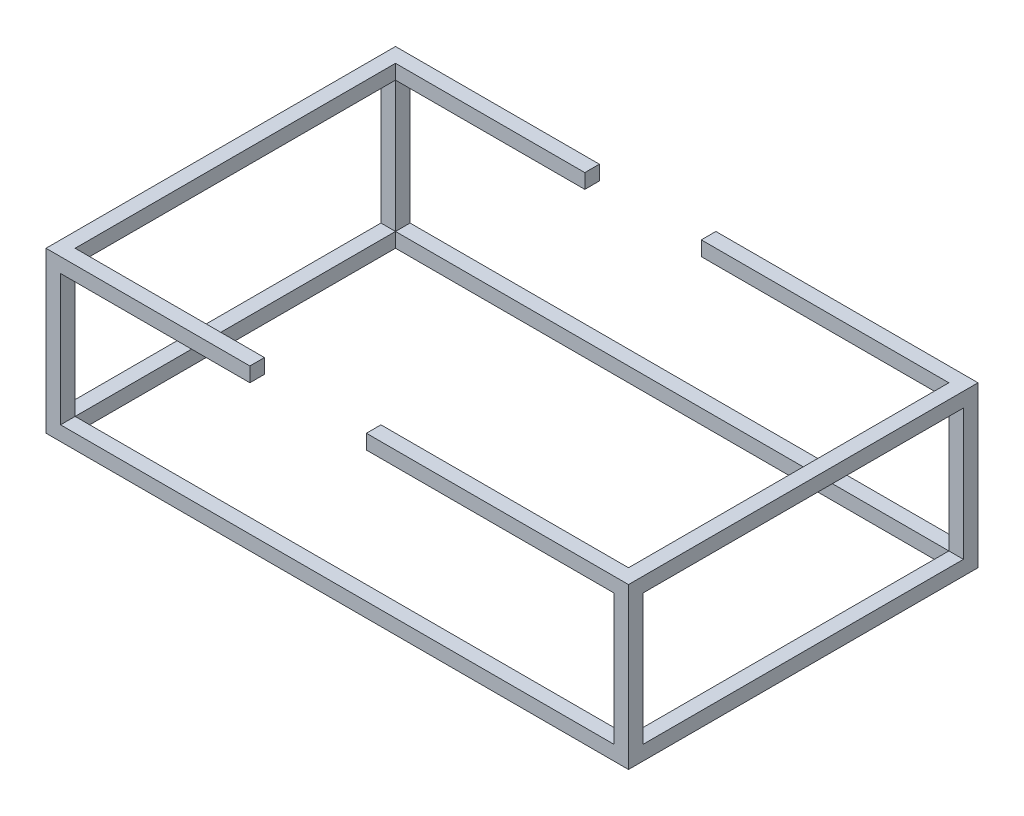
ISO-10303-21;
HEADER;
FILE_DESCRIPTION(('STEP AP214'),'2;1');
FILE_NAME('part.step','',(''),(''),'','','');
FILE_SCHEMA(('AUTOMOTIVE_DESIGN { 1 0 10303 214 1 1 1 1 }'));
ENDSEC;
DATA;
#1=APPLICATION_CONTEXT('core data for automotive mechanical design processes');
#2=APPLICATION_PROTOCOL_DEFINITION('international standard','automotive_design',2000,#1);
#3=PRODUCT_CONTEXT('',#1,'mechanical');
#4=PRODUCT('Part','Part','',(#3));
#5=PRODUCT_RELATED_PRODUCT_CATEGORY('part','',(#4));
#6=PRODUCT_DEFINITION_FORMATION('','',#4);
#7=PRODUCT_DEFINITION_CONTEXT('part definition',#1,'design');
#8=PRODUCT_DEFINITION('design','',#6,#7);
#9=PRODUCT_DEFINITION_SHAPE('','',#8);
#10=(LENGTH_UNIT() NAMED_UNIT(*) SI_UNIT(.MILLI.,.METRE.));
#11=(NAMED_UNIT(*) PLANE_ANGLE_UNIT() SI_UNIT($,.RADIAN.));
#12=(NAMED_UNIT(*) SI_UNIT($,.STERADIAN.) SOLID_ANGLE_UNIT());
#13=UNCERTAINTY_MEASURE_WITH_UNIT(LENGTH_MEASURE(1.E-05),#10,'distance_accuracy_value','');
#14=(GEOMETRIC_REPRESENTATION_CONTEXT(3) GLOBAL_UNCERTAINTY_ASSIGNED_CONTEXT((#13)) GLOBAL_UNIT_ASSIGNED_CONTEXT((#10,
#11,#12)) REPRESENTATION_CONTEXT('',''));
#15=CARTESIAN_POINT('',(0.,0.,0.));
#16=DIRECTION('',(0.,0.,1.));
#17=DIRECTION('',(1.,0.,0.));
#18=AXIS2_PLACEMENT_3D('',#15,#16,#17);
#19=CARTESIAN_POINT('',(-508.,254.,-279.4));
#20=DIRECTION('',(0.,0.,-1.));
#21=DIRECTION('',(-1.,0.,0.));
#22=AXIS2_PLACEMENT_3D('',#19,#20,#21);
#23=PLANE('',#22);
#24=DIRECTION('',(0.,1.,0.));
#25=VECTOR('',#24,1.);
#26=CARTESIAN_POINT('',(-482.6,254.,-279.4));
#27=LINE('',#26,#25);
#28=CARTESIAN_POINT('',(-482.6,254.,-279.4));
#29=VERTEX_POINT('',#28);
#30=CARTESIAN_POINT('',(-482.6,279.4,-279.4));
#31=VERTEX_POINT('',#30);
#32=EDGE_CURVE('E59',#29,#31,#27,.T.);
#33=ORIENTED_EDGE('',*,*,#32,.F.);
#34=DIRECTION('',(1.,0.,0.));
#35=VECTOR('',#34,1.);
#36=CARTESIAN_POINT('',(-508.,254.,-279.4));
#37=LINE('',#36,#35);
#38=CARTESIAN_POINT('',(-152.4,254.,-279.4));
#39=VERTEX_POINT('',#38);
#40=EDGE_CURVE('E330',#29,#39,#37,.T.);
#41=ORIENTED_EDGE('',*,*,#40,.T.);
#42=DIRECTION('',(0.,-1.,0.));
#43=VECTOR('',#42,1.);
#44=CARTESIAN_POINT('',(-152.4,254.,-279.4));
#45=LINE('',#44,#43);
#46=CARTESIAN_POINT('',(-152.4,279.4,-279.4));
#47=VERTEX_POINT('',#46);
#48=EDGE_CURVE('E320',#47,#39,#45,.T.);
#49=ORIENTED_EDGE('',*,*,#48,.F.);
#50=DIRECTION('',(1.,0.,0.));
#51=VECTOR('',#50,1.);
#52=CARTESIAN_POINT('',(-508.,279.4,-279.4));
#53=LINE('',#52,#51);
#54=EDGE_CURVE('E332',#31,#47,#53,.T.);
#55=ORIENTED_EDGE('',*,*,#54,.F.);
#56=EDGE_LOOP('',(#33,#41,#49,#55));
#57=FACE_BOUND('',#56,.T.);
#58=ADVANCED_FACE('F36',(#57),#23,.F.);
#59=DIRECTION('',(1.,0.,0.));
#60=VECTOR('',#59,1.);
#61=CARTESIAN_POINT('',(-482.6,254.,-279.4));
#62=LINE('',#61,#60);
#63=CARTESIAN_POINT('',(-508.,254.,-279.4));
#64=VERTEX_POINT('',#63);
#65=EDGE_CURVE('E242',#64,#29,#62,.T.);
#66=ORIENTED_EDGE('',*,*,#65,.F.);
#67=DIRECTION('',(0.,-1.,0.));
#68=VECTOR('',#67,1.);
#69=CARTESIAN_POINT('',(-508.,254.,-279.4));
#70=LINE('',#69,#68);
#71=CARTESIAN_POINT('',(-508.,25.4,-279.4));
#72=VERTEX_POINT('',#71);
#73=EDGE_CURVE('E413',#64,#72,#70,.T.);
#74=ORIENTED_EDGE('',*,*,#73,.T.);
#75=DIRECTION('',(1.,0.,0.));
#76=VECTOR('',#75,1.);
#77=CARTESIAN_POINT('',(-508.,25.4,-279.4));
#78=LINE('',#77,#76);
#79=CARTESIAN_POINT('',(-482.6,25.4,-279.4));
#80=VERTEX_POINT('',#79);
#81=EDGE_CURVE('E398',#72,#80,#78,.T.);
#82=ORIENTED_EDGE('',*,*,#81,.T.);
#83=DIRECTION('',(0.,-1.,0.));
#84=VECTOR('',#83,1.);
#85=CARTESIAN_POINT('',(-482.6,254.,-279.4));
#86=LINE('',#85,#84);
#87=EDGE_CURVE('E410',#29,#80,#86,.T.);
#88=ORIENTED_EDGE('',*,*,#87,.F.);
#89=EDGE_LOOP('',(#66,#74,#82,#88));
#90=FACE_BOUND('',#89,.T.);
#91=ADVANCED_FACE('F598',(#90),#23,.F.);
#92=CARTESIAN_POINT('',(-482.6,254.,279.4));
#93=DIRECTION('',(0.,0.,1.));
#94=DIRECTION('',(1.,0.,0.));
#95=AXIS2_PLACEMENT_3D('',#92,#93,#94);
#96=PLANE('',#95);
#97=DIRECTION('',(0.,1.,0.));
#98=VECTOR('',#97,1.);
#99=CARTESIAN_POINT('',(-482.6,254.,279.4));
#100=LINE('',#99,#98);
#101=CARTESIAN_POINT('',(-482.6,254.,279.4));
#102=VERTEX_POINT('',#101);
#103=CARTESIAN_POINT('',(-482.6,279.4,279.4));
#104=VERTEX_POINT('',#103);
#105=EDGE_CURVE('E237',#102,#104,#100,.T.);
#106=ORIENTED_EDGE('',*,*,#105,.T.);
#107=DIRECTION('',(1.,0.,0.));
#108=VECTOR('',#107,1.);
#109=CARTESIAN_POINT('',(-508.,279.4,279.4));
#110=LINE('',#109,#108);
#111=CARTESIAN_POINT('',(-152.4,279.4,279.4));
#112=VERTEX_POINT('',#111);
#113=EDGE_CURVE('E222',#104,#112,#110,.T.);
#114=ORIENTED_EDGE('',*,*,#113,.T.);
#115=DIRECTION('',(0.,1.,0.));
#116=VECTOR('',#115,1.);
#117=CARTESIAN_POINT('',(-152.4,254.,279.4));
#118=LINE('',#117,#116);
#119=CARTESIAN_POINT('',(-152.4,254.,279.4));
#120=VERTEX_POINT('',#119);
#121=EDGE_CURVE('E329',#120,#112,#118,.T.);
#122=ORIENTED_EDGE('',*,*,#121,.F.);
#123=DIRECTION('',(1.,0.,0.));
#124=VECTOR('',#123,1.);
#125=CARTESIAN_POINT('',(-508.,254.,279.4));
#126=LINE('',#125,#124);
#127=EDGE_CURVE('E239',#102,#120,#126,.T.);
#128=ORIENTED_EDGE('',*,*,#127,.F.);
#129=EDGE_LOOP('',(#106,#114,#122,#128));
#130=FACE_BOUND('',#129,.T.);
#131=ADVANCED_FACE('F238',(#130),#96,.F.);
#132=DIRECTION('',(1.,0.,0.));
#133=VECTOR('',#132,1.);
#134=CARTESIAN_POINT('',(-482.6,254.,279.4));
#135=LINE('',#134,#133);
#136=CARTESIAN_POINT('',(-508.,254.,279.4));
#137=VERTEX_POINT('',#136);
#138=EDGE_CURVE('E241',#137,#102,#135,.T.);
#139=ORIENTED_EDGE('',*,*,#138,.T.);
#140=DIRECTION('',(0.,-1.,0.));
#141=VECTOR('',#140,1.);
#142=CARTESIAN_POINT('',(-482.6,254.,279.4));
#143=LINE('',#142,#141);
#144=CARTESIAN_POINT('',(-482.6,25.4,279.4));
#145=VERTEX_POINT('',#144);
#146=EDGE_CURVE('E361',#102,#145,#143,.T.);
#147=ORIENTED_EDGE('',*,*,#146,.T.);
#148=DIRECTION('',(-1.,0.,0.));
#149=VECTOR('',#148,1.);
#150=CARTESIAN_POINT('',(-482.6,25.4,279.4));
#151=LINE('',#150,#149);
#152=CARTESIAN_POINT('',(-508.,25.4,279.4));
#153=VERTEX_POINT('',#152);
#154=EDGE_CURVE('E354',#145,#153,#151,.T.);
#155=ORIENTED_EDGE('',*,*,#154,.T.);
#156=DIRECTION('',(0.,-1.,0.));
#157=VECTOR('',#156,1.);
#158=CARTESIAN_POINT('',(-508.,254.,279.4));
#159=LINE('',#158,#157);
#160=EDGE_CURVE('E51',#137,#153,#159,.T.);
#161=ORIENTED_EDGE('',*,*,#160,.F.);
#162=EDGE_LOOP('',(#139,#147,#155,#161));
#163=FACE_BOUND('',#162,.T.);
#164=ADVANCED_FACE('F575',(#163),#96,.F.);
#165=CARTESIAN_POINT('',(508.,254.,-279.4));
#166=DIRECTION('',(0.,0.,-1.));
#167=DIRECTION('',(-1.,0.,0.));
#168=AXIS2_PLACEMENT_3D('',#165,#166,#167);
#169=PLANE('',#168);
#170=DIRECTION('',(0.,-1.,0.));
#171=VECTOR('',#170,1.);
#172=CARTESIAN_POINT('',(482.6,279.4,-279.4));
#173=LINE('',#172,#171);
#174=CARTESIAN_POINT('',(482.6,279.4,-279.4));
#175=VERTEX_POINT('',#174);
#176=CARTESIAN_POINT('',(482.6,254.,-279.4));
#177=VERTEX_POINT('',#176);
#178=EDGE_CURVE('E245',#175,#177,#173,.T.);
#179=ORIENTED_EDGE('',*,*,#178,.F.);
#180=DIRECTION('',(-1.,0.,0.));
#181=VECTOR('',#180,1.);
#182=CARTESIAN_POINT('',(508.,279.4,-279.4));
#183=LINE('',#182,#181);
#184=CARTESIAN_POINT('',(50.8000000000001,279.4,-279.4));
#185=VERTEX_POINT('',#184);
#186=EDGE_CURVE('E288',#175,#185,#183,.T.);
#187=ORIENTED_EDGE('',*,*,#186,.T.);
#188=DIRECTION('',(0.,1.,0.));
#189=VECTOR('',#188,1.);
#190=CARTESIAN_POINT('',(50.8000000000001,254.,-279.4));
#191=LINE('',#190,#189);
#192=CARTESIAN_POINT('',(50.8000000000001,254.,-279.4));
#193=VERTEX_POINT('',#192);
#194=EDGE_CURVE('E278',#193,#185,#191,.T.);
#195=ORIENTED_EDGE('',*,*,#194,.F.);
#196=DIRECTION('',(-1.,0.,0.));
#197=VECTOR('',#196,1.);
#198=CARTESIAN_POINT('',(508.,254.,-279.4));
#199=LINE('',#198,#197);
#200=EDGE_CURVE('E290',#177,#193,#199,.T.);
#201=ORIENTED_EDGE('',*,*,#200,.F.);
#202=EDGE_LOOP('',(#179,#187,#195,#201));
#203=FACE_BOUND('',#202,.T.);
#204=ADVANCED_FACE('F548',(#203),#169,.F.);
#205=DIRECTION('',(1.,0.,0.));
#206=VECTOR('',#205,1.);
#207=CARTESIAN_POINT('',(508.,254.,-279.4));
#208=LINE('',#207,#206);
#209=CARTESIAN_POINT('',(508.,254.,-279.4));
#210=VERTEX_POINT('',#209);
#211=EDGE_CURVE('E249',#177,#210,#208,.T.);
#212=ORIENTED_EDGE('',*,*,#211,.F.);
#213=DIRECTION('',(0.,-1.,0.));
#214=VECTOR('',#213,1.);
#215=CARTESIAN_POINT('',(482.6,254.,-279.4));
#216=LINE('',#215,#214);
#217=CARTESIAN_POINT('',(482.6,25.4,-279.4));
#218=VERTEX_POINT('',#217);
#219=EDGE_CURVE('E392',#177,#218,#216,.T.);
#220=ORIENTED_EDGE('',*,*,#219,.T.);
#221=DIRECTION('',(1.,0.,0.));
#222=VECTOR('',#221,1.);
#223=CARTESIAN_POINT('',(508.,25.4,-279.4));
#224=LINE('',#223,#222);
#225=CARTESIAN_POINT('',(508.,25.4,-279.4));
#226=VERTEX_POINT('',#225);
#227=EDGE_CURVE('E386',#218,#226,#224,.T.);
#228=ORIENTED_EDGE('',*,*,#227,.T.);
#229=DIRECTION('',(0.,-1.,0.));
#230=VECTOR('',#229,1.);
#231=CARTESIAN_POINT('',(508.,254.,-279.4));
#232=LINE('',#231,#230);
#233=EDGE_CURVE('E385',#210,#226,#232,.T.);
#234=ORIENTED_EDGE('',*,*,#233,.F.);
#235=EDGE_LOOP('',(#212,#220,#228,#234));
#236=FACE_BOUND('',#235,.T.);
#237=ADVANCED_FACE('F534',(#236),#169,.F.);
#238=CARTESIAN_POINT('',(482.6,254.,279.4));
#239=DIRECTION('',(0.,0.,1.));
#240=DIRECTION('',(1.,0.,0.));
#241=AXIS2_PLACEMENT_3D('',#238,#239,#240);
#242=PLANE('',#241);
#243=DIRECTION('',(0.,-1.,0.));
#244=VECTOR('',#243,1.);
#245=CARTESIAN_POINT('',(482.6,279.4,279.4));
#246=LINE('',#245,#244);
#247=CARTESIAN_POINT('',(482.6,279.4,279.4));
#248=VERTEX_POINT('',#247);
#249=CARTESIAN_POINT('',(482.6,254.,279.4));
#250=VERTEX_POINT('',#249);
#251=EDGE_CURVE('E255',#248,#250,#246,.T.);
#252=ORIENTED_EDGE('',*,*,#251,.T.);
#253=DIRECTION('',(-1.,0.,0.));
#254=VECTOR('',#253,1.);
#255=CARTESIAN_POINT('',(508.,254.,279.4));
#256=LINE('',#255,#254);
#257=CARTESIAN_POINT('',(50.8000000000001,254.,279.4));
#258=VERTEX_POINT('',#257);
#259=EDGE_CURVE('E306',#250,#258,#256,.T.);
#260=ORIENTED_EDGE('',*,*,#259,.T.);
#261=DIRECTION('',(0.,-1.,0.));
#262=VECTOR('',#261,1.);
#263=CARTESIAN_POINT('',(50.8000000000001,254.,279.4));
#264=LINE('',#263,#262);
#265=CARTESIAN_POINT('',(50.8000000000001,279.4,279.4));
#266=VERTEX_POINT('',#265);
#267=EDGE_CURVE('E287',#266,#258,#264,.T.);
#268=ORIENTED_EDGE('',*,*,#267,.F.);
#269=DIRECTION('',(-1.,0.,0.));
#270=VECTOR('',#269,1.);
#271=CARTESIAN_POINT('',(508.,279.4,279.4));
#272=LINE('',#271,#270);
#273=EDGE_CURVE('E307',#248,#266,#272,.T.);
#274=ORIENTED_EDGE('',*,*,#273,.F.);
#275=EDGE_LOOP('',(#252,#260,#268,#274));
#276=FACE_BOUND('',#275,.T.);
#277=ADVANCED_FACE('F556',(#276),#242,.F.);
#278=DIRECTION('',(1.,0.,0.));
#279=VECTOR('',#278,1.);
#280=CARTESIAN_POINT('',(508.,254.,279.4));
#281=LINE('',#280,#279);
#282=CARTESIAN_POINT('',(508.,254.,279.4));
#283=VERTEX_POINT('',#282);
#284=EDGE_CURVE('E258',#250,#283,#281,.T.);
#285=ORIENTED_EDGE('',*,*,#284,.T.);
#286=DIRECTION('',(0.,-1.,0.));
#287=VECTOR('',#286,1.);
#288=CARTESIAN_POINT('',(508.,254.,279.4));
#289=LINE('',#288,#287);
#290=CARTESIAN_POINT('',(508.,25.4,279.4));
#291=VERTEX_POINT('',#290);
#292=EDGE_CURVE('E376',#283,#291,#289,.T.);
#293=ORIENTED_EDGE('',*,*,#292,.T.);
#294=DIRECTION('',(-1.,0.,0.));
#295=VECTOR('',#294,1.);
#296=CARTESIAN_POINT('',(482.6,25.4,279.4));
#297=LINE('',#296,#295);
#298=CARTESIAN_POINT('',(482.6,25.4,279.4));
#299=VERTEX_POINT('',#298);
#300=EDGE_CURVE('E369',#291,#299,#297,.T.);
#301=ORIENTED_EDGE('',*,*,#300,.T.);
#302=DIRECTION('',(0.,-1.,0.));
#303=VECTOR('',#302,1.);
#304=CARTESIAN_POINT('',(482.6,254.,279.4));
#305=LINE('',#304,#303);
#306=EDGE_CURVE('E368',#250,#299,#305,.T.);
#307=ORIENTED_EDGE('',*,*,#306,.F.);
#308=EDGE_LOOP('',(#285,#293,#301,#307));
#309=FACE_BOUND('',#308,.T.);
#310=ADVANCED_FACE('F529',(#309),#242,.F.);
#311=CARTESIAN_POINT('',(0.,25.4,0.));
#312=DIRECTION('',(0.,-1.,0.));
#313=DIRECTION('',(0.,0.,-1.));
#314=AXIS2_PLACEMENT_3D('',#311,#312,#313);
#315=PLANE('',#314);
#316=DIRECTION('',(0.,0.,-1.));
#317=VECTOR('',#316,1.);
#318=CARTESIAN_POINT('',(-482.6,25.4,279.4));
#319=LINE('',#318,#317);
#320=CARTESIAN_POINT('',(-482.6,25.4,304.8));
#321=VERTEX_POINT('',#320);
#322=EDGE_CURVE('E346',#321,#145,#319,.T.);
#323=ORIENTED_EDGE('',*,*,#322,.F.);
#324=DIRECTION('',(1.,0.,0.));
#325=VECTOR('',#324,1.);
#326=CARTESIAN_POINT('',(-508.,25.4,304.8));
#327=LINE('',#326,#325);
#328=CARTESIAN_POINT('',(482.6,25.4,304.8));
#329=VERTEX_POINT('',#328);
#330=EDGE_CURVE('E459',#321,#329,#327,.T.);
#331=ORIENTED_EDGE('',*,*,#330,.T.);
#332=DIRECTION('',(0.,0.,1.));
#333=VECTOR('',#332,1.);
#334=CARTESIAN_POINT('',(482.6,25.4,279.4));
#335=LINE('',#334,#333);
#336=EDGE_CURVE('E364',#299,#329,#335,.T.);
#337=ORIENTED_EDGE('',*,*,#336,.F.);
#338=DIRECTION('',(1.,0.,0.));
#339=VECTOR('',#338,1.);
#340=CARTESIAN_POINT('',(-482.6,25.4,279.4));
#341=LINE('',#340,#339);
#342=EDGE_CURVE('E419',#145,#299,#341,.T.);
#343=ORIENTED_EDGE('',*,*,#342,.F.);
#344=EDGE_LOOP('',(#323,#331,#337,#343));
#345=FACE_BOUND('',#344,.T.);
#346=ADVANCED_FACE('F513',(#345),#315,.F.);
#347=ORIENTED_EDGE('',*,*,#154,.F.);
#348=DIRECTION('',(0.,0.,1.));
#349=VECTOR('',#348,1.);
#350=CARTESIAN_POINT('',(-482.6,25.4,279.4));
#351=LINE('',#350,#349);
#352=EDGE_CURVE('E416',#80,#145,#351,.T.);
#353=ORIENTED_EDGE('',*,*,#352,.F.);
#354=ORIENTED_EDGE('',*,*,#81,.F.);
#355=DIRECTION('',(0.,0.,1.));
#356=VECTOR('',#355,1.);
#357=CARTESIAN_POINT('',(-508.,25.4,304.8));
#358=LINE('',#357,#356);
#359=EDGE_CURVE('E456',#72,#153,#358,.T.);
#360=ORIENTED_EDGE('',*,*,#359,.T.);
#361=EDGE_LOOP('',(#347,#353,#354,#360));
#362=FACE_BOUND('',#361,.T.);
#363=ADVANCED_FACE('F573',(#362),#315,.F.);
#364=ORIENTED_EDGE('',*,*,#300,.F.);
#365=DIRECTION('',(0.,0.,-1.));
#366=VECTOR('',#365,1.);
#367=CARTESIAN_POINT('',(508.,25.4,304.8));
#368=LINE('',#367,#366);
#369=EDGE_CURVE('E450',#291,#226,#368,.T.);
#370=ORIENTED_EDGE('',*,*,#369,.T.);
#371=ORIENTED_EDGE('',*,*,#227,.F.);
#372=DIRECTION('',(0.,0.,-1.));
#373=VECTOR('',#372,1.);
#374=CARTESIAN_POINT('',(482.6,25.4,279.4));
#375=LINE('',#374,#373);
#376=EDGE_CURVE('E423',#299,#218,#375,.T.);
#377=ORIENTED_EDGE('',*,*,#376,.F.);
#378=EDGE_LOOP('',(#364,#370,#371,#377));
#379=FACE_BOUND('',#378,.T.);
#380=ADVANCED_FACE('F525',(#379),#315,.F.);
#381=DIRECTION('',(0.,0.,1.));
#382=VECTOR('',#381,1.);
#383=CARTESIAN_POINT('',(482.6,25.4,-304.8));
#384=LINE('',#383,#382);
#385=CARTESIAN_POINT('',(482.6,25.4,-304.8));
#386=VERTEX_POINT('',#385);
#387=EDGE_CURVE('E381',#386,#218,#384,.T.);
#388=ORIENTED_EDGE('',*,*,#387,.F.);
#389=DIRECTION('',(-1.,0.,0.));
#390=VECTOR('',#389,1.);
#391=CARTESIAN_POINT('',(-508.,25.4,-304.8));
#392=LINE('',#391,#390);
#393=CARTESIAN_POINT('',(-482.6,25.4,-304.8));
#394=VERTEX_POINT('',#393);
#395=EDGE_CURVE('E453',#386,#394,#392,.T.);
#396=ORIENTED_EDGE('',*,*,#395,.T.);
#397=DIRECTION('',(0.,0.,-1.));
#398=VECTOR('',#397,1.);
#399=CARTESIAN_POINT('',(-482.6,25.4,-304.8));
#400=LINE('',#399,#398);
#401=EDGE_CURVE('E403',#80,#394,#400,.T.);
#402=ORIENTED_EDGE('',*,*,#401,.F.);
#403=DIRECTION('',(-1.,0.,0.));
#404=VECTOR('',#403,1.);
#405=CARTESIAN_POINT('',(-482.6,25.4,-279.4));
#406=LINE('',#405,#404);
#407=EDGE_CURVE('E426',#218,#80,#406,.T.);
#408=ORIENTED_EDGE('',*,*,#407,.F.);
#409=EDGE_LOOP('',(#388,#396,#402,#408));
#410=FACE_BOUND('',#409,.T.);
#411=ADVANCED_FACE('F564',(#410),#315,.F.);
#412=CARTESIAN_POINT('',(0.,0.,0.));
#413=DIRECTION('',(0.,-1.,0.));
#414=DIRECTION('',(0.,0.,-1.));
#415=AXIS2_PLACEMENT_3D('',#412,#413,#414);
#416=PLANE('',#415);
#417=DIRECTION('',(0.,0.,-1.));
#418=VECTOR('',#417,1.);
#419=CARTESIAN_POINT('',(508.,0.,304.8));
#420=LINE('',#419,#418);
#421=CARTESIAN_POINT('',(508.,0.,304.8));
#422=VERTEX_POINT('',#421);
#423=CARTESIAN_POINT('',(508.,0.,-304.8));
#424=VERTEX_POINT('',#423);
#425=EDGE_CURVE('E449',#422,#424,#420,.T.);
#426=ORIENTED_EDGE('',*,*,#425,.F.);
#427=DIRECTION('',(1.,0.,0.));
#428=VECTOR('',#427,1.);
#429=CARTESIAN_POINT('',(-508.,0.,304.8));
#430=LINE('',#429,#428);
#431=CARTESIAN_POINT('',(-508.,0.,304.8));
#432=VERTEX_POINT('',#431);
#433=EDGE_CURVE('E454',#432,#422,#430,.T.);
#434=ORIENTED_EDGE('',*,*,#433,.F.);
#435=DIRECTION('',(0.,0.,1.));
#436=VECTOR('',#435,1.);
#437=CARTESIAN_POINT('',(-508.,0.,304.8));
#438=LINE('',#437,#436);
#439=CARTESIAN_POINT('',(-508.,0.,-304.8));
#440=VERTEX_POINT('',#439);
#441=EDGE_CURVE('E466',#440,#432,#438,.T.);
#442=ORIENTED_EDGE('',*,*,#441,.F.);
#443=DIRECTION('',(-1.,0.,0.));
#444=VECTOR('',#443,1.);
#445=CARTESIAN_POINT('',(-508.,0.,-304.8));
#446=LINE('',#445,#444);
#447=EDGE_CURVE('E464',#424,#440,#446,.T.);
#448=ORIENTED_EDGE('',*,*,#447,.F.);
#449=EDGE_LOOP('',(#426,#434,#442,#448));
#450=FACE_BOUND('',#449,.T.);
#451=DIRECTION('',(-1.,0.,0.));
#452=VECTOR('',#451,1.);
#453=CARTESIAN_POINT('',(-482.6,0.,-279.4));
#454=LINE('',#453,#452);
#455=CARTESIAN_POINT('',(482.6,0.,-279.4));
#456=VERTEX_POINT('',#455);
#457=CARTESIAN_POINT('',(-482.6,0.,-279.4));
#458=VERTEX_POINT('',#457);
#459=EDGE_CURVE('E420',#456,#458,#454,.T.);
#460=ORIENTED_EDGE('',*,*,#459,.T.);
#461=DIRECTION('',(0.,0.,1.));
#462=VECTOR('',#461,1.);
#463=CARTESIAN_POINT('',(-482.6,0.,279.4));
#464=LINE('',#463,#462);
#465=CARTESIAN_POINT('',(-482.6,0.,279.4));
#466=VERTEX_POINT('',#465);
#467=EDGE_CURVE('E415',#458,#466,#464,.T.);
#468=ORIENTED_EDGE('',*,*,#467,.T.);
#469=DIRECTION('',(1.,0.,0.));
#470=VECTOR('',#469,1.);
#471=CARTESIAN_POINT('',(-482.6,0.,279.4));
#472=LINE('',#471,#470);
#473=CARTESIAN_POINT('',(482.6,0.,279.4));
#474=VERTEX_POINT('',#473);
#475=EDGE_CURVE('E432',#466,#474,#472,.T.);
#476=ORIENTED_EDGE('',*,*,#475,.T.);
#477=DIRECTION('',(0.,0.,-1.));
#478=VECTOR('',#477,1.);
#479=CARTESIAN_POINT('',(482.6,0.,279.4));
#480=LINE('',#479,#478);
#481=EDGE_CURVE('E435',#474,#456,#480,.T.);
#482=ORIENTED_EDGE('',*,*,#481,.T.);
#483=EDGE_LOOP('',(#460,#468,#476,#482));
#484=FACE_BOUND('',#483,.T.);
#485=ADVANCED_FACE('F483',(#450,#484),#416,.T.);
#486=CARTESIAN_POINT('',(508.,25.4,304.8));
#487=DIRECTION('',(-1.,0.,0.));
#488=DIRECTION('',(0.,0.,1.));
#489=AXIS2_PLACEMENT_3D('',#486,#487,#488);
#490=PLANE('',#489);
#491=DIRECTION('',(0.,0.,-1.));
#492=VECTOR('',#491,1.);
#493=CARTESIAN_POINT('',(508.,254.,279.4));
#494=LINE('',#493,#492);
#495=EDGE_CURVE('E260',#283,#210,#494,.T.);
#496=ORIENTED_EDGE('',*,*,#495,.T.);
#497=ORIENTED_EDGE('',*,*,#233,.T.);
#498=ORIENTED_EDGE('',*,*,#369,.F.);
#499=ORIENTED_EDGE('',*,*,#292,.F.);
#500=EDGE_LOOP('',(#496,#497,#498,#499));
#501=FACE_BOUND('',#500,.T.);
#502=ORIENTED_EDGE('',*,*,#425,.T.);
#503=DIRECTION('',(0.,-1.,0.));
#504=VECTOR('',#503,1.);
#505=CARTESIAN_POINT('',(508.,25.4,-304.8));
#506=LINE('',#505,#504);
#507=CARTESIAN_POINT('',(508.,279.4,-304.8));
#508=VERTEX_POINT('',#507);
#509=EDGE_CURVE('E11',#508,#424,#506,.T.);
#510=ORIENTED_EDGE('',*,*,#509,.F.);
#511=DIRECTION('',(0.,0.,-1.));
#512=VECTOR('',#511,1.);
#513=CARTESIAN_POINT('',(508.,279.4,279.4));
#514=LINE('',#513,#512);
#515=CARTESIAN_POINT('',(508.,279.4,304.8));
#516=VERTEX_POINT('',#515);
#517=EDGE_CURVE('E304',#516,#508,#514,.T.);
#518=ORIENTED_EDGE('',*,*,#517,.F.);
#519=DIRECTION('',(0.,-1.,0.));
#520=VECTOR('',#519,1.);
#521=CARTESIAN_POINT('',(508.,25.4,304.8));
#522=LINE('',#521,#520);
#523=EDGE_CURVE('E461',#516,#422,#522,.T.);
#524=ORIENTED_EDGE('',*,*,#523,.T.);
#525=EDGE_LOOP('',(#502,#510,#518,#524));
#526=FACE_BOUND('',#525,.T.);
#527=ADVANCED_FACE('F38',(#501,#526),#490,.F.);
#528=CARTESIAN_POINT('',(-508.,25.4,-304.8));
#529=DIRECTION('',(0.,0.,1.));
#530=DIRECTION('',(1.,0.,0.));
#531=AXIS2_PLACEMENT_3D('',#528,#529,#530);
#532=PLANE('',#531);
#533=ORIENTED_EDGE('',*,*,#447,.T.);
#534=DIRECTION('',(0.,-1.,0.));
#535=VECTOR('',#534,1.);
#536=CARTESIAN_POINT('',(-508.,25.4,-304.8));
#537=LINE('',#536,#535);
#538=CARTESIAN_POINT('',(-508.,279.4,-304.8));
#539=VERTEX_POINT('',#538);
#540=EDGE_CURVE('E44',#539,#440,#537,.T.);
#541=ORIENTED_EDGE('',*,*,#540,.F.);
#542=DIRECTION('',(1.,0.,0.));
#543=VECTOR('',#542,1.);
#544=CARTESIAN_POINT('',(-508.,279.4,-304.8));
#545=LINE('',#544,#543);
#546=CARTESIAN_POINT('',(-152.4,279.4,-304.8));
#547=VERTEX_POINT('',#546);
#548=EDGE_CURVE('E326',#539,#547,#545,.T.);
#549=ORIENTED_EDGE('',*,*,#548,.T.);
#550=DIRECTION('',(0.,1.,0.));
#551=VECTOR('',#550,1.);
#552=CARTESIAN_POINT('',(-152.4,254.,-304.8));
#553=LINE('',#552,#551);
#554=CARTESIAN_POINT('',(-152.4,254.,-304.8));
#555=VERTEX_POINT('',#554);
#556=EDGE_CURVE('E309',#555,#547,#553,.T.);
#557=ORIENTED_EDGE('',*,*,#556,.F.);
#558=DIRECTION('',(1.,0.,0.));
#559=VECTOR('',#558,1.);
#560=CARTESIAN_POINT('',(-508.,254.,-304.8));
#561=LINE('',#560,#559);
#562=CARTESIAN_POINT('',(-482.6,254.,-304.8));
#563=VERTEX_POINT('',#562);
#564=EDGE_CURVE('E327',#563,#555,#561,.T.);
#565=ORIENTED_EDGE('',*,*,#564,.F.);
#566=DIRECTION('',(0.,-1.,0.));
#567=VECTOR('',#566,1.);
#568=CARTESIAN_POINT('',(-482.6,254.,-304.8));
#569=LINE('',#568,#567);
#570=EDGE_CURVE('E402',#563,#394,#569,.T.);
#571=ORIENTED_EDGE('',*,*,#570,.T.);
#572=ORIENTED_EDGE('',*,*,#395,.F.);
#573=DIRECTION('',(0.,-1.,0.));
#574=VECTOR('',#573,1.);
#575=CARTESIAN_POINT('',(482.6,254.,-304.8));
#576=LINE('',#575,#574);
#577=CARTESIAN_POINT('',(482.6,254.,-304.8));
#578=VERTEX_POINT('',#577);
#579=EDGE_CURVE('E395',#578,#386,#576,.T.);
#580=ORIENTED_EDGE('',*,*,#579,.F.);
#581=DIRECTION('',(-1.,0.,0.));
#582=VECTOR('',#581,1.);
#583=CARTESIAN_POINT('',(508.,254.,-304.8));
#584=LINE('',#583,#582);
#585=CARTESIAN_POINT('',(50.8000000000001,254.,-304.8));
#586=VERTEX_POINT('',#585);
#587=EDGE_CURVE('E284',#578,#586,#584,.T.);
#588=ORIENTED_EDGE('',*,*,#587,.T.);
#589=DIRECTION('',(0.,-1.,0.));
#590=VECTOR('',#589,1.);
#591=CARTESIAN_POINT('',(50.8000000000001,254.,-304.8));
#592=LINE('',#591,#590);
#593=CARTESIAN_POINT('',(50.8000000000001,279.4,-304.8));
#594=VERTEX_POINT('',#593);
#595=EDGE_CURVE('E272',#594,#586,#592,.T.);
#596=ORIENTED_EDGE('',*,*,#595,.F.);
#597=DIRECTION('',(-1.,0.,0.));
#598=VECTOR('',#597,1.);
#599=CARTESIAN_POINT('',(508.,279.4,-304.8));
#600=LINE('',#599,#598);
#601=EDGE_CURVE('E285',#508,#594,#600,.T.);
#602=ORIENTED_EDGE('',*,*,#601,.F.);
#603=ORIENTED_EDGE('',*,*,#509,.T.);
#604=EDGE_LOOP('',(#533,#541,#549,#557,#565,#571,#572,#580,#588,#596,#602,#603));
#605=FACE_BOUND('',#604,.T.);
#606=ADVANCED_FACE('F560',(#605),#532,.F.);
#607=CARTESIAN_POINT('',(-508.,25.4,304.8));
#608=DIRECTION('',(1.,0.,0.));
#609=DIRECTION('',(0.,0.,-1.));
#610=AXIS2_PLACEMENT_3D('',#607,#608,#609);
#611=PLANE('',#610);
#612=ORIENTED_EDGE('',*,*,#73,.F.);
#613=DIRECTION('',(0.,0.,-1.));
#614=VECTOR('',#613,1.);
#615=CARTESIAN_POINT('',(-508.,254.,279.4));
#616=LINE('',#615,#614);
#617=EDGE_CURVE('E246',#137,#64,#616,.T.);
#618=ORIENTED_EDGE('',*,*,#617,.F.);
#619=ORIENTED_EDGE('',*,*,#160,.T.);
#620=ORIENTED_EDGE('',*,*,#359,.F.);
#621=EDGE_LOOP('',(#612,#618,#619,#620));
#622=FACE_BOUND('',#621,.T.);
#623=ORIENTED_EDGE('',*,*,#441,.T.);
#624=DIRECTION('',(0.,-1.,0.));
#625=VECTOR('',#624,1.);
#626=CARTESIAN_POINT('',(-508.,25.4,304.8));
#627=LINE('',#626,#625);
#628=CARTESIAN_POINT('',(-508.,279.4,304.8));
#629=VERTEX_POINT('',#628);
#630=EDGE_CURVE('E471',#629,#432,#627,.T.);
#631=ORIENTED_EDGE('',*,*,#630,.F.);
#632=DIRECTION('',(0.,0.,1.));
#633=VECTOR('',#632,1.);
#634=CARTESIAN_POINT('',(-508.,279.4,279.4));
#635=LINE('',#634,#633);
#636=EDGE_CURVE('E233',#539,#629,#635,.T.);
#637=ORIENTED_EDGE('',*,*,#636,.F.);
#638=ORIENTED_EDGE('',*,*,#540,.T.);
#639=EDGE_LOOP('',(#623,#631,#637,#638));
#640=FACE_BOUND('',#639,.T.);
#641=ADVANCED_FACE('F477',(#622,#640),#611,.F.);
#642=CARTESIAN_POINT('',(-508.,25.4,304.8));
#643=DIRECTION('',(0.,0.,-1.));
#644=DIRECTION('',(-1.,0.,0.));
#645=AXIS2_PLACEMENT_3D('',#642,#643,#644);
#646=PLANE('',#645);
#647=ORIENTED_EDGE('',*,*,#433,.T.);
#648=ORIENTED_EDGE('',*,*,#523,.F.);
#649=DIRECTION('',(-1.,0.,0.));
#650=VECTOR('',#649,1.);
#651=CARTESIAN_POINT('',(508.,279.4,304.8));
#652=LINE('',#651,#650);
#653=CARTESIAN_POINT('',(50.8000000000001,279.4,304.8));
#654=VERTEX_POINT('',#653);
#655=EDGE_CURVE('E310',#516,#654,#652,.T.);
#656=ORIENTED_EDGE('',*,*,#655,.T.);
#657=DIRECTION('',(0.,1.,0.));
#658=VECTOR('',#657,1.);
#659=CARTESIAN_POINT('',(50.8000000000001,254.,304.8));
#660=LINE('',#659,#658);
#661=CARTESIAN_POINT('',(50.8000000000001,254.,304.8));
#662=VERTEX_POINT('',#661);
#663=EDGE_CURVE('E298',#662,#654,#660,.T.);
#664=ORIENTED_EDGE('',*,*,#663,.F.);
#665=DIRECTION('',(-1.,0.,0.));
#666=VECTOR('',#665,1.);
#667=CARTESIAN_POINT('',(508.,254.,304.8));
#668=LINE('',#667,#666);
#669=CARTESIAN_POINT('',(482.6,254.,304.8));
#670=VERTEX_POINT('',#669);
#671=EDGE_CURVE('E312',#670,#662,#668,.T.);
#672=ORIENTED_EDGE('',*,*,#671,.F.);
#673=DIRECTION('',(0.,-1.,0.));
#674=VECTOR('',#673,1.);
#675=CARTESIAN_POINT('',(482.6,254.,304.8));
#676=LINE('',#675,#674);
#677=EDGE_CURVE('E378',#670,#329,#676,.T.);
#678=ORIENTED_EDGE('',*,*,#677,.T.);
#679=ORIENTED_EDGE('',*,*,#330,.F.);
#680=DIRECTION('',(0.,-1.,0.));
#681=VECTOR('',#680,1.);
#682=CARTESIAN_POINT('',(-482.6,254.,304.8));
#683=LINE('',#682,#681);
#684=CARTESIAN_POINT('',(-482.6,254.,304.8));
#685=VERTEX_POINT('',#684);
#686=EDGE_CURVE('E353',#685,#321,#683,.T.);
#687=ORIENTED_EDGE('',*,*,#686,.F.);
#688=DIRECTION('',(1.,0.,0.));
#689=VECTOR('',#688,1.);
#690=CARTESIAN_POINT('',(-508.,254.,304.8));
#691=LINE('',#690,#689);
#692=CARTESIAN_POINT('',(-152.4,254.,304.8));
#693=VERTEX_POINT('',#692);
#694=EDGE_CURVE('E347',#685,#693,#691,.T.);
#695=ORIENTED_EDGE('',*,*,#694,.T.);
#696=DIRECTION('',(0.,-1.,0.));
#697=VECTOR('',#696,1.);
#698=CARTESIAN_POINT('',(-152.4,254.,304.8));
#699=LINE('',#698,#697);
#700=CARTESIAN_POINT('',(-152.4,279.4,304.8));
#701=VERTEX_POINT('',#700);
#702=EDGE_CURVE('E337',#701,#693,#699,.T.);
#703=ORIENTED_EDGE('',*,*,#702,.F.);
#704=DIRECTION('',(1.,0.,0.));
#705=VECTOR('',#704,1.);
#706=CARTESIAN_POINT('',(-508.,279.4,304.8));
#707=LINE('',#706,#705);
#708=EDGE_CURVE('E232',#629,#701,#707,.T.);
#709=ORIENTED_EDGE('',*,*,#708,.F.);
#710=ORIENTED_EDGE('',*,*,#630,.T.);
#711=EDGE_LOOP('',(#647,#648,#656,#664,#672,#678,#679,#687,#695,#703,#709,#710));
#712=FACE_BOUND('',#711,.T.);
#713=ADVANCED_FACE('F486',(#712),#646,.F.);
#714=CARTESIAN_POINT('',(-482.6,25.4,279.4));
#715=DIRECTION('',(1.,0.,0.));
#716=DIRECTION('',(0.,0.,-1.));
#717=AXIS2_PLACEMENT_3D('',#714,#715,#716);
#718=PLANE('',#717);
#719=ORIENTED_EDGE('',*,*,#467,.F.);
#720=DIRECTION('',(0.,-1.,0.));
#721=VECTOR('',#720,1.);
#722=CARTESIAN_POINT('',(-482.6,25.4,-279.4));
#723=LINE('',#722,#721);
#724=EDGE_CURVE('E429',#80,#458,#723,.T.);
#725=ORIENTED_EDGE('',*,*,#724,.F.);
#726=ORIENTED_EDGE('',*,*,#352,.T.);
#727=DIRECTION('',(0.,-1.,0.));
#728=VECTOR('',#727,1.);
#729=CARTESIAN_POINT('',(-482.6,25.4,279.4));
#730=LINE('',#729,#728);
#731=EDGE_CURVE('E446',#145,#466,#730,.T.);
#732=ORIENTED_EDGE('',*,*,#731,.T.);
#733=EDGE_LOOP('',(#719,#725,#726,#732));
#734=FACE_BOUND('',#733,.T.);
#735=ADVANCED_FACE('F570',(#734),#718,.T.);
#736=CARTESIAN_POINT('',(-482.6,25.4,279.4));
#737=DIRECTION('',(0.,0.,-1.));
#738=DIRECTION('',(-1.,0.,0.));
#739=AXIS2_PLACEMENT_3D('',#736,#737,#738);
#740=PLANE('',#739);
#741=ORIENTED_EDGE('',*,*,#475,.F.);
#742=ORIENTED_EDGE('',*,*,#731,.F.);
#743=ORIENTED_EDGE('',*,*,#342,.T.);
#744=DIRECTION('',(0.,-1.,0.));
#745=VECTOR('',#744,1.);
#746=CARTESIAN_POINT('',(482.6,25.4,279.4));
#747=LINE('',#746,#745);
#748=EDGE_CURVE('E444',#299,#474,#747,.T.);
#749=ORIENTED_EDGE('',*,*,#748,.T.);
#750=EDGE_LOOP('',(#741,#742,#743,#749));
#751=FACE_BOUND('',#750,.T.);
#752=ADVANCED_FACE('F517',(#751),#740,.T.);
#753=CARTESIAN_POINT('',(482.6,25.4,279.4));
#754=DIRECTION('',(-1.,0.,0.));
#755=DIRECTION('',(0.,0.,1.));
#756=AXIS2_PLACEMENT_3D('',#753,#754,#755);
#757=PLANE('',#756);
#758=ORIENTED_EDGE('',*,*,#481,.F.);
#759=ORIENTED_EDGE('',*,*,#748,.F.);
#760=ORIENTED_EDGE('',*,*,#376,.T.);
#761=DIRECTION('',(0.,-1.,0.));
#762=VECTOR('',#761,1.);
#763=CARTESIAN_POINT('',(482.6,25.4,-279.4));
#764=LINE('',#763,#762);
#765=EDGE_CURVE('E442',#218,#456,#764,.T.);
#766=ORIENTED_EDGE('',*,*,#765,.T.);
#767=EDGE_LOOP('',(#758,#759,#760,#766));
#768=FACE_BOUND('',#767,.T.);
#769=ADVANCED_FACE('F521',(#768),#757,.T.);
#770=CARTESIAN_POINT('',(-482.6,25.4,-279.4));
#771=DIRECTION('',(0.,0.,1.));
#772=DIRECTION('',(1.,0.,0.));
#773=AXIS2_PLACEMENT_3D('',#770,#771,#772);
#774=PLANE('',#773);
#775=ORIENTED_EDGE('',*,*,#459,.F.);
#776=ORIENTED_EDGE('',*,*,#765,.F.);
#777=ORIENTED_EDGE('',*,*,#407,.T.);
#778=ORIENTED_EDGE('',*,*,#724,.T.);
#779=EDGE_LOOP('',(#775,#776,#777,#778));
#780=FACE_BOUND('',#779,.T.);
#781=ADVANCED_FACE('F567',(#780),#774,.T.);
#782=CARTESIAN_POINT('',(-482.6,254.,-304.8));
#783=DIRECTION('',(-1.,0.,0.));
#784=DIRECTION('',(0.,0.,1.));
#785=AXIS2_PLACEMENT_3D('',#782,#783,#784);
#786=PLANE('',#785);
#787=ORIENTED_EDGE('',*,*,#401,.T.);
#788=ORIENTED_EDGE('',*,*,#570,.F.);
#789=DIRECTION('',(0.,0.,-1.));
#790=VECTOR('',#789,1.);
#791=CARTESIAN_POINT('',(-482.6,254.,-304.8));
#792=LINE('',#791,#790);
#793=EDGE_CURVE('E399',#29,#563,#792,.T.);
#794=ORIENTED_EDGE('',*,*,#793,.F.);
#795=ORIENTED_EDGE('',*,*,#87,.T.);
#796=EDGE_LOOP('',(#787,#788,#794,#795));
#797=FACE_BOUND('',#796,.T.);
#798=ADVANCED_FACE('F607',(#797),#786,.F.);
#799=CARTESIAN_POINT('',(482.6,254.,-304.8));
#800=DIRECTION('',(1.,0.,0.));
#801=DIRECTION('',(0.,0.,-1.));
#802=AXIS2_PLACEMENT_3D('',#799,#800,#801);
#803=PLANE('',#802);
#804=ORIENTED_EDGE('',*,*,#387,.T.);
#805=ORIENTED_EDGE('',*,*,#219,.F.);
#806=DIRECTION('',(0.,0.,1.));
#807=VECTOR('',#806,1.);
#808=CARTESIAN_POINT('',(482.6,254.,-304.8));
#809=LINE('',#808,#807);
#810=EDGE_CURVE('E382',#578,#177,#809,.T.);
#811=ORIENTED_EDGE('',*,*,#810,.F.);
#812=ORIENTED_EDGE('',*,*,#579,.T.);
#813=EDGE_LOOP('',(#804,#805,#811,#812));
#814=FACE_BOUND('',#813,.T.);
#815=ADVANCED_FACE('F538',(#814),#803,.F.);
#816=CARTESIAN_POINT('',(482.6,254.,279.4));
#817=DIRECTION('',(1.,0.,0.));
#818=DIRECTION('',(0.,0.,-1.));
#819=AXIS2_PLACEMENT_3D('',#816,#817,#818);
#820=PLANE('',#819);
#821=ORIENTED_EDGE('',*,*,#336,.T.);
#822=ORIENTED_EDGE('',*,*,#677,.F.);
#823=DIRECTION('',(0.,0.,1.));
#824=VECTOR('',#823,1.);
#825=CARTESIAN_POINT('',(482.6,254.,279.4));
#826=LINE('',#825,#824);
#827=EDGE_CURVE('E365',#250,#670,#826,.T.);
#828=ORIENTED_EDGE('',*,*,#827,.F.);
#829=ORIENTED_EDGE('',*,*,#306,.T.);
#830=EDGE_LOOP('',(#821,#822,#828,#829));
#831=FACE_BOUND('',#830,.T.);
#832=ADVANCED_FACE('F509',(#831),#820,.F.);
#833=CARTESIAN_POINT('',(-482.6,254.,279.4));
#834=DIRECTION('',(-1.,0.,0.));
#835=DIRECTION('',(0.,0.,1.));
#836=AXIS2_PLACEMENT_3D('',#833,#834,#835);
#837=PLANE('',#836);
#838=ORIENTED_EDGE('',*,*,#322,.T.);
#839=ORIENTED_EDGE('',*,*,#146,.F.);
#840=DIRECTION('',(0.,0.,-1.));
#841=VECTOR('',#840,1.);
#842=CARTESIAN_POINT('',(-482.6,254.,279.4));
#843=LINE('',#842,#841);
#844=EDGE_CURVE('E350',#685,#102,#843,.T.);
#845=ORIENTED_EDGE('',*,*,#844,.F.);
#846=ORIENTED_EDGE('',*,*,#686,.T.);
#847=EDGE_LOOP('',(#838,#839,#845,#846));
#848=FACE_BOUND('',#847,.T.);
#849=ADVANCED_FACE('F580',(#848),#837,.F.);
#850=CARTESIAN_POINT('',(-508.,254.,279.4));
#851=DIRECTION('',(0.,-1.,0.));
#852=DIRECTION('',(0.,0.,-1.));
#853=AXIS2_PLACEMENT_3D('',#850,#851,#852);
#854=PLANE('',#853);
#855=ORIENTED_EDGE('',*,*,#844,.T.);
#856=ORIENTED_EDGE('',*,*,#127,.T.);
#857=DIRECTION('',(0.,0.,-1.));
#858=VECTOR('',#857,1.);
#859=CARTESIAN_POINT('',(-152.4,254.,279.4));
#860=LINE('',#859,#858);
#861=EDGE_CURVE('E340',#693,#120,#860,.T.);
#862=ORIENTED_EDGE('',*,*,#861,.F.);
#863=ORIENTED_EDGE('',*,*,#694,.F.);
#864=EDGE_LOOP('',(#855,#856,#862,#863));
#865=FACE_BOUND('',#864,.T.);
#866=ADVANCED_FACE('F587',(#865),#854,.T.);
#867=CARTESIAN_POINT('',(-508.,279.4,279.4));
#868=DIRECTION('',(0.,1.,0.));
#869=DIRECTION('',(0.,0.,1.));
#870=AXIS2_PLACEMENT_3D('',#867,#868,#869);
#871=PLANE('',#870);
#872=ORIENTED_EDGE('',*,*,#708,.T.);
#873=DIRECTION('',(0.,0.,1.));
#874=VECTOR('',#873,1.);
#875=CARTESIAN_POINT('',(-152.4,279.4,279.4));
#876=LINE('',#875,#874);
#877=EDGE_CURVE('E228',#112,#701,#876,.T.);
#878=ORIENTED_EDGE('',*,*,#877,.F.);
#879=ORIENTED_EDGE('',*,*,#113,.F.);
#880=DIRECTION('',(0.,0.,-1.));
#881=VECTOR('',#880,1.);
#882=CARTESIAN_POINT('',(-482.6,279.4,279.4));
#883=LINE('',#882,#881);
#884=EDGE_CURVE('E225',#104,#31,#883,.T.);
#885=ORIENTED_EDGE('',*,*,#884,.T.);
#886=ORIENTED_EDGE('',*,*,#54,.T.);
#887=DIRECTION('',(0.,0.,1.));
#888=VECTOR('',#887,1.);
#889=CARTESIAN_POINT('',(-152.4,279.4,-304.8));
#890=LINE('',#889,#888);
#891=EDGE_CURVE('E317',#547,#47,#890,.T.);
#892=ORIENTED_EDGE('',*,*,#891,.F.);
#893=ORIENTED_EDGE('',*,*,#548,.F.);
#894=ORIENTED_EDGE('',*,*,#636,.T.);
#895=EDGE_LOOP('',(#872,#878,#879,#885,#886,#892,#893,#894));
#896=FACE_BOUND('',#895,.T.);
#897=ADVANCED_FACE('F224',(#896),#871,.T.);
#898=CARTESIAN_POINT('',(-152.4,0.,0.));
#899=DIRECTION('',(1.,0.,0.));
#900=DIRECTION('',(0.,0.,-1.));
#901=AXIS2_PLACEMENT_3D('',#898,#899,#900);
#902=PLANE('',#901);
#903=ORIENTED_EDGE('',*,*,#121,.T.);
#904=ORIENTED_EDGE('',*,*,#877,.T.);
#905=ORIENTED_EDGE('',*,*,#702,.T.);
#906=ORIENTED_EDGE('',*,*,#861,.T.);
#907=EDGE_LOOP('',(#903,#904,#905,#906));
#908=FACE_BOUND('',#907,.T.);
#909=ADVANCED_FACE('F586',(#908),#902,.T.);
#910=CARTESIAN_POINT('',(-508.,254.,-304.8));
#911=DIRECTION('',(0.,-1.,0.));
#912=DIRECTION('',(0.,0.,-1.));
#913=AXIS2_PLACEMENT_3D('',#910,#911,#912);
#914=PLANE('',#913);
#915=ORIENTED_EDGE('',*,*,#793,.T.);
#916=ORIENTED_EDGE('',*,*,#564,.T.);
#917=DIRECTION('',(0.,0.,-1.));
#918=VECTOR('',#917,1.);
#919=CARTESIAN_POINT('',(-152.4,254.,-304.8));
#920=LINE('',#919,#918);
#921=EDGE_CURVE('E323',#39,#555,#920,.T.);
#922=ORIENTED_EDGE('',*,*,#921,.F.);
#923=ORIENTED_EDGE('',*,*,#40,.F.);
#924=EDGE_LOOP('',(#915,#916,#922,#923));
#925=FACE_BOUND('',#924,.T.);
#926=ADVANCED_FACE('F746',(#925),#914,.T.);
#927=CARTESIAN_POINT('',(-152.4,0.,0.));
#928=DIRECTION('',(1.,0.,0.));
#929=DIRECTION('',(0.,0.,-1.));
#930=AXIS2_PLACEMENT_3D('',#927,#928,#929);
#931=PLANE('',#930);
#932=ORIENTED_EDGE('',*,*,#556,.T.);
#933=ORIENTED_EDGE('',*,*,#891,.T.);
#934=ORIENTED_EDGE('',*,*,#48,.T.);
#935=ORIENTED_EDGE('',*,*,#921,.T.);
#936=EDGE_LOOP('',(#932,#933,#934,#935));
#937=FACE_BOUND('',#936,.T.);
#938=ADVANCED_FACE('F741',(#937),#931,.T.);
#939=CARTESIAN_POINT('',(508.,254.,279.4));
#940=DIRECTION('',(0.,-1.,0.));
#941=DIRECTION('',(0.,0.,-1.));
#942=AXIS2_PLACEMENT_3D('',#939,#940,#941);
#943=PLANE('',#942);
#944=ORIENTED_EDGE('',*,*,#827,.T.);
#945=ORIENTED_EDGE('',*,*,#671,.T.);
#946=DIRECTION('',(0.,0.,1.));
#947=VECTOR('',#946,1.);
#948=CARTESIAN_POINT('',(50.8000000000001,254.,279.4));
#949=LINE('',#948,#947);
#950=EDGE_CURVE('E295',#258,#662,#949,.T.);
#951=ORIENTED_EDGE('',*,*,#950,.F.);
#952=ORIENTED_EDGE('',*,*,#259,.F.);
#953=EDGE_LOOP('',(#944,#945,#951,#952));
#954=FACE_BOUND('',#953,.T.);
#955=ADVANCED_FACE('F505',(#954),#943,.T.);
#956=CARTESIAN_POINT('',(508.,279.4,279.4));
#957=DIRECTION('',(0.,1.,0.));
#958=DIRECTION('',(0.,0.,1.));
#959=AXIS2_PLACEMENT_3D('',#956,#957,#958);
#960=PLANE('',#959);
#961=ORIENTED_EDGE('',*,*,#517,.T.);
#962=ORIENTED_EDGE('',*,*,#601,.T.);
#963=DIRECTION('',(0.,0.,-1.));
#964=VECTOR('',#963,1.);
#965=CARTESIAN_POINT('',(50.8000000000001,279.4,-304.8));
#966=LINE('',#965,#964);
#967=EDGE_CURVE('E281',#185,#594,#966,.T.);
#968=ORIENTED_EDGE('',*,*,#967,.F.);
#969=ORIENTED_EDGE('',*,*,#186,.F.);
#970=DIRECTION('',(0.,0.,-1.));
#971=VECTOR('',#970,1.);
#972=CARTESIAN_POINT('',(482.6,279.4,279.4));
#973=LINE('',#972,#971);
#974=EDGE_CURVE('E269',#248,#175,#973,.T.);
#975=ORIENTED_EDGE('',*,*,#974,.F.);
#976=ORIENTED_EDGE('',*,*,#273,.T.);
#977=DIRECTION('',(0.,0.,-1.));
#978=VECTOR('',#977,1.);
#979=CARTESIAN_POINT('',(50.8000000000001,279.4,279.4));
#980=LINE('',#979,#978);
#981=EDGE_CURVE('E301',#654,#266,#980,.T.);
#982=ORIENTED_EDGE('',*,*,#981,.F.);
#983=ORIENTED_EDGE('',*,*,#655,.F.);
#984=EDGE_LOOP('',(#961,#962,#968,#969,#975,#976,#982,#983));
#985=FACE_BOUND('',#984,.T.);
#986=ADVANCED_FACE('F494',(#985),#960,.T.);
#987=CARTESIAN_POINT('',(50.8000000000001,0.,0.));
#988=DIRECTION('',(1.,0.,0.));
#989=DIRECTION('',(0.,0.,-1.));
#990=AXIS2_PLACEMENT_3D('',#987,#988,#989);
#991=PLANE('',#990);
#992=ORIENTED_EDGE('',*,*,#267,.T.);
#993=ORIENTED_EDGE('',*,*,#950,.T.);
#994=ORIENTED_EDGE('',*,*,#663,.T.);
#995=ORIENTED_EDGE('',*,*,#981,.T.);
#996=EDGE_LOOP('',(#992,#993,#994,#995));
#997=FACE_BOUND('',#996,.T.);
#998=ADVANCED_FACE('F500',(#997),#991,.F.);
#999=CARTESIAN_POINT('',(508.,254.,-304.8));
#1000=DIRECTION('',(0.,-1.,0.));
#1001=DIRECTION('',(0.,0.,-1.));
#1002=AXIS2_PLACEMENT_3D('',#999,#1000,#1001);
#1003=PLANE('',#1002);
#1004=ORIENTED_EDGE('',*,*,#810,.T.);
#1005=ORIENTED_EDGE('',*,*,#200,.T.);
#1006=DIRECTION('',(0.,0.,1.));
#1007=VECTOR('',#1006,1.);
#1008=CARTESIAN_POINT('',(50.8000000000001,254.,-304.8));
#1009=LINE('',#1008,#1007);
#1010=EDGE_CURVE('E275',#586,#193,#1009,.T.);
#1011=ORIENTED_EDGE('',*,*,#1010,.F.);
#1012=ORIENTED_EDGE('',*,*,#587,.F.);
#1013=EDGE_LOOP('',(#1004,#1005,#1011,#1012));
#1014=FACE_BOUND('',#1013,.T.);
#1015=ADVANCED_FACE('F543',(#1014),#1003,.T.);
#1016=CARTESIAN_POINT('',(50.8000000000001,0.,0.));
#1017=DIRECTION('',(1.,0.,0.));
#1018=DIRECTION('',(0.,0.,-1.));
#1019=AXIS2_PLACEMENT_3D('',#1016,#1017,#1018);
#1020=PLANE('',#1019);
#1021=ORIENTED_EDGE('',*,*,#595,.T.);
#1022=ORIENTED_EDGE('',*,*,#1010,.T.);
#1023=ORIENTED_EDGE('',*,*,#194,.T.);
#1024=ORIENTED_EDGE('',*,*,#967,.T.);
#1025=EDGE_LOOP('',(#1021,#1022,#1023,#1024));
#1026=FACE_BOUND('',#1025,.T.);
#1027=ADVANCED_FACE('F558',(#1026),#1020,.F.);
#1028=CARTESIAN_POINT('',(482.6,279.4,279.4));
#1029=DIRECTION('',(1.,0.,0.));
#1030=DIRECTION('',(0.,0.,-1.));
#1031=AXIS2_PLACEMENT_3D('',#1028,#1029,#1030);
#1032=PLANE('',#1031);
#1033=ORIENTED_EDGE('',*,*,#178,.T.);
#1034=DIRECTION('',(0.,0.,-1.));
#1035=VECTOR('',#1034,1.);
#1036=CARTESIAN_POINT('',(482.6,254.,279.4));
#1037=LINE('',#1036,#1035);
#1038=EDGE_CURVE('E266',#250,#177,#1037,.T.);
#1039=ORIENTED_EDGE('',*,*,#1038,.F.);
#1040=ORIENTED_EDGE('',*,*,#251,.F.);
#1041=ORIENTED_EDGE('',*,*,#974,.T.);
#1042=EDGE_LOOP('',(#1033,#1039,#1040,#1041));
#1043=FACE_BOUND('',#1042,.T.);
#1044=ADVANCED_FACE('F550',(#1043),#1032,.F.);
#1045=CARTESIAN_POINT('',(508.,254.,279.4));
#1046=DIRECTION('',(0.,1.,0.));
#1047=DIRECTION('',(0.,0.,1.));
#1048=AXIS2_PLACEMENT_3D('',#1045,#1046,#1047);
#1049=PLANE('',#1048);
#1050=ORIENTED_EDGE('',*,*,#211,.T.);
#1051=ORIENTED_EDGE('',*,*,#495,.F.);
#1052=ORIENTED_EDGE('',*,*,#284,.F.);
#1053=ORIENTED_EDGE('',*,*,#1038,.T.);
#1054=EDGE_LOOP('',(#1050,#1051,#1052,#1053));
#1055=FACE_BOUND('',#1054,.T.);
#1056=ADVANCED_FACE('F553',(#1055),#1049,.F.);
#1057=CARTESIAN_POINT('',(-482.6,254.,279.4));
#1058=DIRECTION('',(-1.,0.,0.));
#1059=DIRECTION('',(0.,0.,1.));
#1060=AXIS2_PLACEMENT_3D('',#1057,#1058,#1059);
#1061=PLANE('',#1060);
#1062=ORIENTED_EDGE('',*,*,#32,.T.);
#1063=ORIENTED_EDGE('',*,*,#884,.F.);
#1064=ORIENTED_EDGE('',*,*,#105,.F.);
#1065=DIRECTION('',(0.,0.,-1.));
#1066=VECTOR('',#1065,1.);
#1067=CARTESIAN_POINT('',(-482.6,254.,279.4));
#1068=LINE('',#1067,#1066);
#1069=EDGE_CURVE('E251',#102,#29,#1068,.T.);
#1070=ORIENTED_EDGE('',*,*,#1069,.T.);
#1071=EDGE_LOOP('',(#1062,#1063,#1064,#1070));
#1072=FACE_BOUND('',#1071,.T.);
#1073=ADVANCED_FACE('F244',(#1072),#1061,.F.);
#1074=CARTESIAN_POINT('',(-482.6,254.,279.4));
#1075=DIRECTION('',(0.,1.,0.));
#1076=DIRECTION('',(0.,0.,1.));
#1077=AXIS2_PLACEMENT_3D('',#1074,#1075,#1076);
#1078=PLANE('',#1077);
#1079=ORIENTED_EDGE('',*,*,#65,.T.);
#1080=ORIENTED_EDGE('',*,*,#1069,.F.);
#1081=ORIENTED_EDGE('',*,*,#138,.F.);
#1082=ORIENTED_EDGE('',*,*,#617,.T.);
#1083=EDGE_LOOP('',(#1079,#1080,#1081,#1082));
#1084=FACE_BOUND('',#1083,.T.);
#1085=ADVANCED_FACE('F881',(#1084),#1078,.F.);
#1086=CLOSED_SHELL('',(#58,#91,#131,#164,#204,#237,#277,#310,#346,#363,#380,#411,#485,#527,#606,
#641,#713,#735,#752,#769,#781,#798,#815,#832,#849,#866,#897,#909,#926,#938,#955,#986,#998,#1015,
#1027,#1044,#1056,#1073,#1085));
#1087=MANIFOLD_SOLID_BREP('B2',#1086);
#1088=ADVANCED_BREP_SHAPE_REPRESENTATION('',(#18,#1087),#14);
#1089=SHAPE_DEFINITION_REPRESENTATION(#9,#1088);
ENDSEC;
END-ISO-10303-21;
